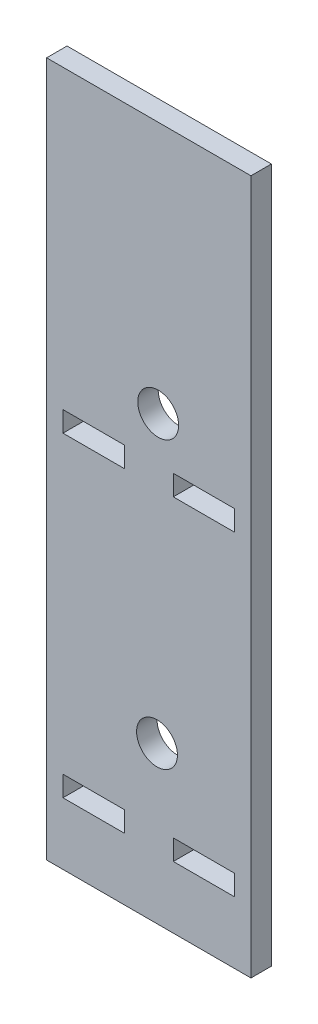
ISO-10303-21;
HEADER;
FILE_DESCRIPTION(('STEP AP214'),'2;1');
FILE_NAME('part.step','',(''),(''),'','','');
FILE_SCHEMA(('AUTOMOTIVE_DESIGN { 1 0 10303 214 1 1 1 1 }'));
ENDSEC;
DATA;
#1=APPLICATION_CONTEXT('core data for automotive mechanical design processes');
#2=APPLICATION_PROTOCOL_DEFINITION('international standard','automotive_design',2000,#1);
#3=PRODUCT_CONTEXT('',#1,'mechanical');
#4=PRODUCT('Part','Part','',(#3));
#5=PRODUCT_RELATED_PRODUCT_CATEGORY('part','',(#4));
#6=PRODUCT_DEFINITION_FORMATION('','',#4);
#7=PRODUCT_DEFINITION_CONTEXT('part definition',#1,'design');
#8=PRODUCT_DEFINITION('design','',#6,#7);
#9=PRODUCT_DEFINITION_SHAPE('','',#8);
#10=(LENGTH_UNIT() NAMED_UNIT(*) SI_UNIT(.MILLI.,.METRE.));
#11=(NAMED_UNIT(*) PLANE_ANGLE_UNIT() SI_UNIT($,.RADIAN.));
#12=(NAMED_UNIT(*) SI_UNIT($,.STERADIAN.) SOLID_ANGLE_UNIT());
#13=UNCERTAINTY_MEASURE_WITH_UNIT(LENGTH_MEASURE(1.E-05),#10,'distance_accuracy_value','');
#14=(GEOMETRIC_REPRESENTATION_CONTEXT(3) GLOBAL_UNCERTAINTY_ASSIGNED_CONTEXT((#13)) GLOBAL_UNIT_ASSIGNED_CONTEXT((#10,
#11,#12)) REPRESENTATION_CONTEXT('',''));
#15=CARTESIAN_POINT('',(0.,0.,0.));
#16=DIRECTION('',(0.,0.,1.));
#17=DIRECTION('',(1.,0.,0.));
#18=AXIS2_PLACEMENT_3D('',#15,#16,#17);
#19=CARTESIAN_POINT('',(0.,0.,5.));
#20=DIRECTION('',(0.,0.,1.));
#21=DIRECTION('',(1.,0.,0.));
#22=AXIS2_PLACEMENT_3D('',#19,#20,#21);
#23=PLANE('',#22);
#24=CARTESIAN_POINT('',(-15.705505675789,29.9997392423794,5.));
#25=DIRECTION('',(0.,0.,1.));
#26=DIRECTION('',(1.,0.,0.));
#27=AXIS2_PLACEMENT_3D('',#24,#25,#26);
#28=CIRCLE('',#27,4.99999999999426);
#29=CARTESIAN_POINT('',(-10.7055056757948,29.9997392423794,5.));
#30=VERTEX_POINT('',#29);
#31=EDGE_CURVE('E277',#30,#30,#28,.T.);
#32=ORIENTED_EDGE('',*,*,#31,.F.);
#33=EDGE_LOOP('',(#32));
#34=FACE_BOUND('',#33,.T.);
#35=DIRECTION('',(0.,-1.,0.));
#36=VECTOR('',#35,1.);
#37=CARTESIAN_POINT('',(-42.7193109279734,161.759780871255,5.));
#38=LINE('',#37,#36);
#39=CARTESIAN_POINT('',(-42.7193109279734,161.759780871255,5.));
#40=VERTEX_POINT('',#39);
#41=CARTESIAN_POINT('',(-42.7193109279733,-8.2402191287452,5.));
#42=VERTEX_POINT('',#41);
#43=EDGE_CURVE('E314',#40,#42,#38,.T.);
#44=ORIENTED_EDGE('',*,*,#43,.T.);
#45=DIRECTION('',(1.,0.,0.));
#46=VECTOR('',#45,1.);
#47=CARTESIAN_POINT('',(-42.7193109279733,-8.2402191287452,5.));
#48=LINE('',#47,#46);
#49=CARTESIAN_POINT('',(7.28068907202665,-8.2402191287452,5.));
#50=VERTEX_POINT('',#49);
#51=EDGE_CURVE('E317',#42,#50,#48,.T.);
#52=ORIENTED_EDGE('',*,*,#51,.T.);
#53=DIRECTION('',(0.,1.,0.));
#54=VECTOR('',#53,1.);
#55=CARTESIAN_POINT('',(7.28068907202665,-8.2402191287452,5.));
#56=LINE('',#55,#54);
#57=CARTESIAN_POINT('',(7.28068907202668,161.759780871255,5.));
#58=VERTEX_POINT('',#57);
#59=EDGE_CURVE('E320',#50,#58,#56,.T.);
#60=ORIENTED_EDGE('',*,*,#59,.T.);
#61=DIRECTION('',(-1.,0.,0.));
#62=VECTOR('',#61,1.);
#63=CARTESIAN_POINT('',(7.28068907202668,161.759780871255,5.));
#64=LINE('',#63,#62);
#65=EDGE_CURVE('E322',#58,#40,#64,.T.);
#66=ORIENTED_EDGE('',*,*,#65,.T.);
#67=EDGE_LOOP('',(#44,#52,#60,#66));
#68=FACE_BOUND('',#67,.T.);
#69=DIRECTION('',(0.,1.,0.));
#70=VECTOR('',#69,1.);
#71=CARTESIAN_POINT('',(-23.7193109279733,11.9498357263154,5.));
#72=LINE('',#71,#70);
#73=CARTESIAN_POINT('',(-23.7193109279733,6.94983572631544,5.));
#74=VERTEX_POINT('',#73);
#75=CARTESIAN_POINT('',(-23.7193109279733,11.9498357263154,5.));
#76=VERTEX_POINT('',#75);
#77=EDGE_CURVE('E285',#74,#76,#72,.T.);
#78=ORIENTED_EDGE('',*,*,#77,.F.);
#79=DIRECTION('',(1.,0.,0.));
#80=VECTOR('',#79,1.);
#81=CARTESIAN_POINT('',(-23.7193109279733,6.94983572631544,5.));
#82=LINE('',#81,#80);
#83=CARTESIAN_POINT('',(-38.7193109279734,6.94983572631544,5.));
#84=VERTEX_POINT('',#83);
#85=EDGE_CURVE('E283',#84,#74,#82,.T.);
#86=ORIENTED_EDGE('',*,*,#85,.F.);
#87=DIRECTION('',(0.,-1.,0.));
#88=VECTOR('',#87,1.);
#89=CARTESIAN_POINT('',(-38.7193109279734,6.94983572631544,5.));
#90=LINE('',#89,#88);
#91=CARTESIAN_POINT('',(-38.7193109279734,11.9498357263154,5.));
#92=VERTEX_POINT('',#91);
#93=EDGE_CURVE('E291',#92,#84,#90,.T.);
#94=ORIENTED_EDGE('',*,*,#93,.F.);
#95=DIRECTION('',(-1.,0.,0.));
#96=VECTOR('',#95,1.);
#97=CARTESIAN_POINT('',(-38.7193109279734,11.9498357263154,5.));
#98=LINE('',#97,#96);
#99=EDGE_CURVE('E288',#76,#92,#98,.T.);
#100=ORIENTED_EDGE('',*,*,#99,.F.);
#101=EDGE_LOOP('',(#78,#86,#94,#100));
#102=FACE_BOUND('',#101,.T.);
#103=CARTESIAN_POINT('',(-15.4136462347418,99.9997392423794,5.));
#104=DIRECTION('',(0.,0.,1.));
#105=DIRECTION('',(1.,0.,0.));
#106=AXIS2_PLACEMENT_3D('',#103,#104,#105);
#107=CIRCLE('',#106,4.99999999998085);
#108=CARTESIAN_POINT('',(-10.4136462347609,99.9997392423794,5.));
#109=VERTEX_POINT('',#108);
#110=EDGE_CURVE('E271',#109,#109,#107,.T.);
#111=ORIENTED_EDGE('',*,*,#110,.F.);
#112=EDGE_LOOP('',(#111));
#113=FACE_BOUND('',#112,.T.);
#114=DIRECTION('',(1.,0.,0.));
#115=VECTOR('',#114,1.);
#116=CARTESIAN_POINT('',(-38.7193109279734,84.2165810531214,5.));
#117=LINE('',#116,#115);
#118=CARTESIAN_POINT('',(-38.7193109279734,84.2165810531214,5.));
#119=VERTEX_POINT('',#118);
#120=CARTESIAN_POINT('',(-23.7193109279733,84.2165810531214,5.));
#121=VERTEX_POINT('',#120);
#122=EDGE_CURVE('E242',#119,#121,#117,.T.);
#123=ORIENTED_EDGE('',*,*,#122,.F.);
#124=DIRECTION('',(0.,-1.,0.));
#125=VECTOR('',#124,1.);
#126=CARTESIAN_POINT('',(-38.7193109279734,89.2165810531214,5.));
#127=LINE('',#126,#125);
#128=CARTESIAN_POINT('',(-38.7193109279734,89.2165810531214,5.));
#129=VERTEX_POINT('',#128);
#130=EDGE_CURVE('E240',#129,#119,#127,.T.);
#131=ORIENTED_EDGE('',*,*,#130,.F.);
#132=DIRECTION('',(-1.,0.,0.));
#133=VECTOR('',#132,1.);
#134=CARTESIAN_POINT('',(-23.7193109279733,89.2165810531214,5.));
#135=LINE('',#134,#133);
#136=CARTESIAN_POINT('',(-23.7193109279733,89.2165810531214,5.));
#137=VERTEX_POINT('',#136);
#138=EDGE_CURVE('E248',#137,#129,#135,.T.);
#139=ORIENTED_EDGE('',*,*,#138,.F.);
#140=DIRECTION('',(0.,1.,0.));
#141=VECTOR('',#140,1.);
#142=CARTESIAN_POINT('',(-23.7193109279733,84.2165810531214,5.));
#143=LINE('',#142,#141);
#144=EDGE_CURVE('E245',#121,#137,#143,.T.);
#145=ORIENTED_EDGE('',*,*,#144,.F.);
#146=EDGE_LOOP('',(#123,#131,#139,#145));
#147=FACE_BOUND('',#146,.T.);
#148=DIRECTION('',(-1.,0.,0.));
#149=VECTOR('',#148,1.);
#150=CARTESIAN_POINT('',(-11.7193109279733,89.2165810531214,5.));
#151=LINE('',#150,#149);
#152=CARTESIAN_POINT('',(3.28068907202665,89.2165810531214,5.));
#153=VERTEX_POINT('',#152);
#154=CARTESIAN_POINT('',(-11.7193109279733,89.2165810531214,5.));
#155=VERTEX_POINT('',#154);
#156=EDGE_CURVE('E211',#153,#155,#151,.T.);
#157=ORIENTED_EDGE('',*,*,#156,.F.);
#158=DIRECTION('',(0.,1.,0.));
#159=VECTOR('',#158,1.);
#160=CARTESIAN_POINT('',(3.28068907202665,89.2165810531214,5.));
#161=LINE('',#160,#159);
#162=CARTESIAN_POINT('',(3.28068907202665,84.2165810531214,5.));
#163=VERTEX_POINT('',#162);
#164=EDGE_CURVE('E209',#163,#153,#161,.T.);
#165=ORIENTED_EDGE('',*,*,#164,.F.);
#166=DIRECTION('',(1.,0.,0.));
#167=VECTOR('',#166,1.);
#168=CARTESIAN_POINT('',(3.28068907202665,84.2165810531214,5.));
#169=LINE('',#168,#167);
#170=CARTESIAN_POINT('',(-11.7193109279733,84.2165810531214,5.));
#171=VERTEX_POINT('',#170);
#172=EDGE_CURVE('E217',#171,#163,#169,.T.);
#173=ORIENTED_EDGE('',*,*,#172,.F.);
#174=DIRECTION('',(0.,-1.,0.));
#175=VECTOR('',#174,1.);
#176=CARTESIAN_POINT('',(-11.7193109279733,84.2165810531214,5.));
#177=LINE('',#176,#175);
#178=EDGE_CURVE('E214',#155,#171,#177,.T.);
#179=ORIENTED_EDGE('',*,*,#178,.F.);
#180=EDGE_LOOP('',(#157,#165,#173,#179));
#181=FACE_BOUND('',#180,.T.);
#182=DIRECTION('',(0.,-1.,0.));
#183=VECTOR('',#182,1.);
#184=CARTESIAN_POINT('',(-11.7193109279733,11.9498357263154,5.));
#185=LINE('',#184,#183);
#186=CARTESIAN_POINT('',(-11.7193109279733,11.9498357263154,5.));
#187=VERTEX_POINT('',#186);
#188=CARTESIAN_POINT('',(-11.7193109279733,6.94983572631544,5.));
#189=VERTEX_POINT('',#188);
#190=EDGE_CURVE('E181',#187,#189,#185,.T.);
#191=ORIENTED_EDGE('',*,*,#190,.F.);
#192=DIRECTION('',(-1.,0.,0.));
#193=VECTOR('',#192,1.);
#194=CARTESIAN_POINT('',(3.28068907202665,11.9498357263154,5.));
#195=LINE('',#194,#193);
#196=CARTESIAN_POINT('',(3.28068907202665,11.9498357263154,5.));
#197=VERTEX_POINT('',#196);
#198=EDGE_CURVE('E173',#197,#187,#195,.T.);
#199=ORIENTED_EDGE('',*,*,#198,.F.);
#200=DIRECTION('',(0.,1.,0.));
#201=VECTOR('',#200,1.);
#202=CARTESIAN_POINT('',(3.28068907202665,6.94983572631544,5.));
#203=LINE('',#202,#201);
#204=CARTESIAN_POINT('',(3.28068907202665,6.94983572631544,5.));
#205=VERTEX_POINT('',#204);
#206=EDGE_CURVE('E195',#205,#197,#203,.T.);
#207=ORIENTED_EDGE('',*,*,#206,.F.);
#208=DIRECTION('',(1.,0.,0.));
#209=VECTOR('',#208,1.);
#210=CARTESIAN_POINT('',(-11.7193109279733,6.94983572631544,5.));
#211=LINE('',#210,#209);
#212=EDGE_CURVE('E193',#189,#205,#211,.T.);
#213=ORIENTED_EDGE('',*,*,#212,.F.);
#214=EDGE_LOOP('',(#191,#199,#207,#213));
#215=FACE_BOUND('',#214,.T.);
#216=ADVANCED_FACE('F36',(#34,#68,#102,#113,#147,#181,#215),#23,.T.);
#217=CARTESIAN_POINT('',(0.,0.,0.));
#218=DIRECTION('',(0.,0.,1.));
#219=DIRECTION('',(1.,0.,0.));
#220=AXIS2_PLACEMENT_3D('',#217,#218,#219);
#221=PLANE('',#220);
#222=DIRECTION('',(0.,1.,0.));
#223=VECTOR('',#222,1.);
#224=CARTESIAN_POINT('',(3.28068907202665,89.2165810531214,0.));
#225=LINE('',#224,#223);
#226=CARTESIAN_POINT('',(3.28068907202665,84.2165810531214,0.));
#227=VERTEX_POINT('',#226);
#228=CARTESIAN_POINT('',(3.28068907202665,89.2165810531214,0.));
#229=VERTEX_POINT('',#228);
#230=EDGE_CURVE('E189',#227,#229,#225,.T.);
#231=ORIENTED_EDGE('',*,*,#230,.T.);
#232=DIRECTION('',(-1.,0.,0.));
#233=VECTOR('',#232,1.);
#234=CARTESIAN_POINT('',(-11.7193109279733,89.2165810531214,0.));
#235=LINE('',#234,#233);
#236=CARTESIAN_POINT('',(-11.7193109279733,89.2165810531214,0.));
#237=VERTEX_POINT('',#236);
#238=EDGE_CURVE('E222',#229,#237,#235,.T.);
#239=ORIENTED_EDGE('',*,*,#238,.T.);
#240=DIRECTION('',(0.,-1.,0.));
#241=VECTOR('',#240,1.);
#242=CARTESIAN_POINT('',(-11.7193109279733,84.2165810531214,0.));
#243=LINE('',#242,#241);
#244=CARTESIAN_POINT('',(-11.7193109279733,84.2165810531214,0.));
#245=VERTEX_POINT('',#244);
#246=EDGE_CURVE('E225',#237,#245,#243,.T.);
#247=ORIENTED_EDGE('',*,*,#246,.T.);
#248=DIRECTION('',(1.,0.,0.));
#249=VECTOR('',#248,1.);
#250=CARTESIAN_POINT('',(3.28068907202665,84.2165810531214,0.));
#251=LINE('',#250,#249);
#252=EDGE_CURVE('E212',#245,#227,#251,.T.);
#253=ORIENTED_EDGE('',*,*,#252,.T.);
#254=EDGE_LOOP('',(#231,#239,#247,#253));
#255=FACE_BOUND('',#254,.T.);
#256=CARTESIAN_POINT('',(-15.4136462347418,99.9997392423794,0.));
#257=DIRECTION('',(0.,0.,1.));
#258=DIRECTION('',(1.,0.,0.));
#259=AXIS2_PLACEMENT_3D('',#256,#257,#258);
#260=CIRCLE('',#259,4.99999999998085);
#261=CARTESIAN_POINT('',(-10.4136462347609,99.9997392423794,0.));
#262=VERTEX_POINT('',#261);
#263=EDGE_CURVE('E270',#262,#262,#260,.T.);
#264=ORIENTED_EDGE('',*,*,#263,.T.);
#265=EDGE_LOOP('',(#264));
#266=FACE_BOUND('',#265,.T.);
#267=CARTESIAN_POINT('',(-15.705505675789,29.9997392423794,0.));
#268=DIRECTION('',(0.,0.,1.));
#269=DIRECTION('',(1.,0.,0.));
#270=AXIS2_PLACEMENT_3D('',#267,#268,#269);
#271=CIRCLE('',#270,4.99999999999426);
#272=CARTESIAN_POINT('',(-10.7055056757948,29.9997392423794,0.));
#273=VERTEX_POINT('',#272);
#274=EDGE_CURVE('E274',#273,#273,#271,.T.);
#275=ORIENTED_EDGE('',*,*,#274,.T.);
#276=EDGE_LOOP('',(#275));
#277=FACE_BOUND('',#276,.T.);
#278=DIRECTION('',(1.,0.,0.));
#279=VECTOR('',#278,1.);
#280=CARTESIAN_POINT('',(-23.7193109279733,6.94983572631544,0.));
#281=LINE('',#280,#279);
#282=CARTESIAN_POINT('',(-38.7193109279734,6.94983572631544,0.));
#283=VERTEX_POINT('',#282);
#284=CARTESIAN_POINT('',(-23.7193109279733,6.94983572631544,0.));
#285=VERTEX_POINT('',#284);
#286=EDGE_CURVE('E280',#283,#285,#281,.T.);
#287=ORIENTED_EDGE('',*,*,#286,.T.);
#288=DIRECTION('',(0.,1.,0.));
#289=VECTOR('',#288,1.);
#290=CARTESIAN_POINT('',(-23.7193109279733,11.9498357263154,0.));
#291=LINE('',#290,#289);
#292=CARTESIAN_POINT('',(-23.7193109279733,11.9498357263154,0.));
#293=VERTEX_POINT('',#292);
#294=EDGE_CURVE('E296',#285,#293,#291,.T.);
#295=ORIENTED_EDGE('',*,*,#294,.T.);
#296=DIRECTION('',(-1.,0.,0.));
#297=VECTOR('',#296,1.);
#298=CARTESIAN_POINT('',(-38.7193109279734,11.9498357263154,0.));
#299=LINE('',#298,#297);
#300=CARTESIAN_POINT('',(-38.7193109279734,11.9498357263154,0.));
#301=VERTEX_POINT('',#300);
#302=EDGE_CURVE('E299',#293,#301,#299,.T.);
#303=ORIENTED_EDGE('',*,*,#302,.T.);
#304=DIRECTION('',(0.,-1.,0.));
#305=VECTOR('',#304,1.);
#306=CARTESIAN_POINT('',(-38.7193109279734,6.94983572631544,0.));
#307=LINE('',#306,#305);
#308=EDGE_CURVE('E286',#301,#283,#307,.T.);
#309=ORIENTED_EDGE('',*,*,#308,.T.);
#310=EDGE_LOOP('',(#287,#295,#303,#309));
#311=FACE_BOUND('',#310,.T.);
#312=DIRECTION('',(0.,-1.,0.));
#313=VECTOR('',#312,1.);
#314=CARTESIAN_POINT('',(-42.7193109279734,161.759780871255,0.));
#315=LINE('',#314,#313);
#316=CARTESIAN_POINT('',(-42.7193109279734,161.759780871255,0.));
#317=VERTEX_POINT('',#316);
#318=CARTESIAN_POINT('',(-42.7193109279733,-8.2402191287452,0.));
#319=VERTEX_POINT('',#318);
#320=EDGE_CURVE('E313',#317,#319,#315,.T.);
#321=ORIENTED_EDGE('',*,*,#320,.F.);
#322=DIRECTION('',(-1.,0.,0.));
#323=VECTOR('',#322,1.);
#324=CARTESIAN_POINT('',(7.28068907202668,161.759780871255,0.));
#325=LINE('',#324,#323);
#326=CARTESIAN_POINT('',(7.28068907202668,161.759780871255,0.));
#327=VERTEX_POINT('',#326);
#328=EDGE_CURVE('E318',#327,#317,#325,.T.);
#329=ORIENTED_EDGE('',*,*,#328,.F.);
#330=DIRECTION('',(0.,1.,0.));
#331=VECTOR('',#330,1.);
#332=CARTESIAN_POINT('',(7.28068907202665,-8.2402191287452,0.));
#333=LINE('',#332,#331);
#334=CARTESIAN_POINT('',(7.28068907202665,-8.2402191287452,0.));
#335=VERTEX_POINT('',#334);
#336=EDGE_CURVE('E329',#335,#327,#333,.T.);
#337=ORIENTED_EDGE('',*,*,#336,.F.);
#338=DIRECTION('',(1.,0.,0.));
#339=VECTOR('',#338,1.);
#340=CARTESIAN_POINT('',(-42.7193109279733,-8.2402191287452,0.));
#341=LINE('',#340,#339);
#342=EDGE_CURVE('E327',#319,#335,#341,.T.);
#343=ORIENTED_EDGE('',*,*,#342,.F.);
#344=EDGE_LOOP('',(#321,#329,#337,#343));
#345=FACE_BOUND('',#344,.T.);
#346=DIRECTION('',(0.,-1.,0.));
#347=VECTOR('',#346,1.);
#348=CARTESIAN_POINT('',(-38.7193109279734,89.2165810531214,0.));
#349=LINE('',#348,#347);
#350=CARTESIAN_POINT('',(-38.7193109279734,89.2165810531214,0.));
#351=VERTEX_POINT('',#350);
#352=CARTESIAN_POINT('',(-38.7193109279734,84.2165810531214,0.));
#353=VERTEX_POINT('',#352);
#354=EDGE_CURVE('E239',#351,#353,#349,.T.);
#355=ORIENTED_EDGE('',*,*,#354,.T.);
#356=DIRECTION('',(1.,0.,0.));
#357=VECTOR('',#356,1.);
#358=CARTESIAN_POINT('',(-38.7193109279734,84.2165810531214,0.));
#359=LINE('',#358,#357);
#360=CARTESIAN_POINT('',(-23.7193109279733,84.2165810531214,0.));
#361=VERTEX_POINT('',#360);
#362=EDGE_CURVE('E253',#353,#361,#359,.T.);
#363=ORIENTED_EDGE('',*,*,#362,.T.);
#364=DIRECTION('',(0.,1.,0.));
#365=VECTOR('',#364,1.);
#366=CARTESIAN_POINT('',(-23.7193109279733,84.2165810531214,0.));
#367=LINE('',#366,#365);
#368=CARTESIAN_POINT('',(-23.7193109279733,89.2165810531214,0.));
#369=VERTEX_POINT('',#368);
#370=EDGE_CURVE('E256',#361,#369,#367,.T.);
#371=ORIENTED_EDGE('',*,*,#370,.T.);
#372=DIRECTION('',(-1.,0.,0.));
#373=VECTOR('',#372,1.);
#374=CARTESIAN_POINT('',(-23.7193109279733,89.2165810531214,0.));
#375=LINE('',#374,#373);
#376=EDGE_CURVE('E243',#369,#351,#375,.T.);
#377=ORIENTED_EDGE('',*,*,#376,.T.);
#378=EDGE_LOOP('',(#355,#363,#371,#377));
#379=FACE_BOUND('',#378,.T.);
#380=DIRECTION('',(-1.,0.,0.));
#381=VECTOR('',#380,1.);
#382=CARTESIAN_POINT('',(3.28068907202665,11.9498357263154,0.));
#383=LINE('',#382,#381);
#384=CARTESIAN_POINT('',(3.28068907202665,11.9498357263154,0.));
#385=VERTEX_POINT('',#384);
#386=CARTESIAN_POINT('',(-11.7193109279733,11.9498357263154,0.));
#387=VERTEX_POINT('',#386);
#388=EDGE_CURVE('E59',#385,#387,#383,.T.);
#389=ORIENTED_EDGE('',*,*,#388,.T.);
#390=DIRECTION('',(0.,-1.,0.));
#391=VECTOR('',#390,1.);
#392=CARTESIAN_POINT('',(-11.7193109279733,11.9498357263154,0.));
#393=LINE('',#392,#391);
#394=CARTESIAN_POINT('',(-11.7193109279733,6.94983572631544,0.));
#395=VERTEX_POINT('',#394);
#396=EDGE_CURVE('E188',#387,#395,#393,.T.);
#397=ORIENTED_EDGE('',*,*,#396,.T.);
#398=DIRECTION('',(1.,0.,0.));
#399=VECTOR('',#398,1.);
#400=CARTESIAN_POINT('',(-11.7193109279733,6.94983572631544,0.));
#401=LINE('',#400,#399);
#402=CARTESIAN_POINT('',(3.28068907202665,6.94983572631544,0.));
#403=VERTEX_POINT('',#402);
#404=EDGE_CURVE('E201',#395,#403,#401,.T.);
#405=ORIENTED_EDGE('',*,*,#404,.T.);
#406=DIRECTION('',(0.,1.,0.));
#407=VECTOR('',#406,1.);
#408=CARTESIAN_POINT('',(3.28068907202665,6.94983572631544,0.));
#409=LINE('',#408,#407);
#410=EDGE_CURVE('E182',#403,#385,#409,.T.);
#411=ORIENTED_EDGE('',*,*,#410,.T.);
#412=EDGE_LOOP('',(#389,#397,#405,#411));
#413=FACE_BOUND('',#412,.T.);
#414=ADVANCED_FACE('F347',(#255,#266,#277,#311,#345,#379,#413),#221,.F.);
#415=CARTESIAN_POINT('',(-42.7193109279734,161.759780871255,5.));
#416=DIRECTION('',(1.,0.,0.));
#417=DIRECTION('',(0.,1.,0.));
#418=AXIS2_PLACEMENT_3D('',#415,#416,#417);
#419=PLANE('',#418);
#420=ORIENTED_EDGE('',*,*,#320,.T.);
#421=DIRECTION('',(0.,0.,-1.));
#422=VECTOR('',#421,1.);
#423=CARTESIAN_POINT('',(-42.7193109279733,-8.2402191287452,5.));
#424=LINE('',#423,#422);
#425=EDGE_CURVE('E11',#42,#319,#424,.T.);
#426=ORIENTED_EDGE('',*,*,#425,.F.);
#427=ORIENTED_EDGE('',*,*,#43,.F.);
#428=DIRECTION('',(0.,0.,-1.));
#429=VECTOR('',#428,1.);
#430=CARTESIAN_POINT('',(-42.7193109279734,161.759780871255,5.));
#431=LINE('',#430,#429);
#432=EDGE_CURVE('E324',#40,#317,#431,.T.);
#433=ORIENTED_EDGE('',*,*,#432,.T.);
#434=EDGE_LOOP('',(#420,#426,#427,#433));
#435=FACE_BOUND('',#434,.T.);
#436=ADVANCED_FACE('F38',(#435),#419,.F.);
#437=CARTESIAN_POINT('',(-42.7193109279733,-8.2402191287452,5.));
#438=DIRECTION('',(0.,1.,0.));
#439=DIRECTION('',(0.,0.,1.));
#440=AXIS2_PLACEMENT_3D('',#437,#438,#439);
#441=PLANE('',#440);
#442=ORIENTED_EDGE('',*,*,#342,.T.);
#443=DIRECTION('',(0.,0.,-1.));
#444=VECTOR('',#443,1.);
#445=CARTESIAN_POINT('',(7.28068907202665,-8.2402191287452,5.));
#446=LINE('',#445,#444);
#447=EDGE_CURVE('E44',#50,#335,#446,.T.);
#448=ORIENTED_EDGE('',*,*,#447,.F.);
#449=ORIENTED_EDGE('',*,*,#51,.F.);
#450=ORIENTED_EDGE('',*,*,#425,.T.);
#451=EDGE_LOOP('',(#442,#448,#449,#450));
#452=FACE_BOUND('',#451,.T.);
#453=ADVANCED_FACE('F358',(#452),#441,.F.);
#454=CARTESIAN_POINT('',(7.28068907202665,-8.2402191287452,5.));
#455=DIRECTION('',(-1.,0.,0.));
#456=DIRECTION('',(0.,-1.,0.));
#457=AXIS2_PLACEMENT_3D('',#454,#455,#456);
#458=PLANE('',#457);
#459=ORIENTED_EDGE('',*,*,#336,.T.);
#460=DIRECTION('',(0.,0.,-1.));
#461=VECTOR('',#460,1.);
#462=CARTESIAN_POINT('',(7.28068907202668,161.759780871255,5.));
#463=LINE('',#462,#461);
#464=EDGE_CURVE('E334',#58,#327,#463,.T.);
#465=ORIENTED_EDGE('',*,*,#464,.F.);
#466=ORIENTED_EDGE('',*,*,#59,.F.);
#467=ORIENTED_EDGE('',*,*,#447,.T.);
#468=EDGE_LOOP('',(#459,#465,#466,#467));
#469=FACE_BOUND('',#468,.T.);
#470=ADVANCED_FACE('F341',(#469),#458,.F.);
#471=CARTESIAN_POINT('',(7.28068907202668,161.759780871255,5.));
#472=DIRECTION('',(0.,-1.,0.));
#473=DIRECTION('',(0.,0.,-1.));
#474=AXIS2_PLACEMENT_3D('',#471,#472,#473);
#475=PLANE('',#474);
#476=ORIENTED_EDGE('',*,*,#328,.T.);
#477=ORIENTED_EDGE('',*,*,#432,.F.);
#478=ORIENTED_EDGE('',*,*,#65,.F.);
#479=ORIENTED_EDGE('',*,*,#464,.T.);
#480=EDGE_LOOP('',(#476,#477,#478,#479));
#481=FACE_BOUND('',#480,.T.);
#482=ADVANCED_FACE('F351',(#481),#475,.F.);
#483=CARTESIAN_POINT('',(-23.7193109279733,6.94983572631544,5.));
#484=DIRECTION('',(0.,1.,0.));
#485=DIRECTION('',(0.,0.,1.));
#486=AXIS2_PLACEMENT_3D('',#483,#484,#485);
#487=PLANE('',#486);
#488=ORIENTED_EDGE('',*,*,#286,.F.);
#489=DIRECTION('',(0.,0.,-1.));
#490=VECTOR('',#489,1.);
#491=CARTESIAN_POINT('',(-38.7193109279734,6.94983572631544,5.));
#492=LINE('',#491,#490);
#493=EDGE_CURVE('E293',#84,#283,#492,.T.);
#494=ORIENTED_EDGE('',*,*,#493,.F.);
#495=ORIENTED_EDGE('',*,*,#85,.T.);
#496=DIRECTION('',(0.,0.,-1.));
#497=VECTOR('',#496,1.);
#498=CARTESIAN_POINT('',(-23.7193109279733,6.94983572631544,5.));
#499=LINE('',#498,#497);
#500=EDGE_CURVE('E310',#74,#285,#499,.T.);
#501=ORIENTED_EDGE('',*,*,#500,.T.);
#502=EDGE_LOOP('',(#488,#494,#495,#501));
#503=FACE_BOUND('',#502,.T.);
#504=ADVANCED_FACE('F375',(#503),#487,.T.);
#505=CARTESIAN_POINT('',(-23.7193109279733,11.9498357263154,5.));
#506=DIRECTION('',(-1.,0.,0.));
#507=DIRECTION('',(0.,0.,1.));
#508=AXIS2_PLACEMENT_3D('',#505,#506,#507);
#509=PLANE('',#508);
#510=ORIENTED_EDGE('',*,*,#294,.F.);
#511=ORIENTED_EDGE('',*,*,#500,.F.);
#512=ORIENTED_EDGE('',*,*,#77,.T.);
#513=DIRECTION('',(0.,0.,-1.));
#514=VECTOR('',#513,1.);
#515=CARTESIAN_POINT('',(-23.7193109279733,11.9498357263154,5.));
#516=LINE('',#515,#514);
#517=EDGE_CURVE('E308',#76,#293,#516,.T.);
#518=ORIENTED_EDGE('',*,*,#517,.T.);
#519=EDGE_LOOP('',(#510,#511,#512,#518));
#520=FACE_BOUND('',#519,.T.);
#521=ADVANCED_FACE('F382',(#520),#509,.T.);
#522=CARTESIAN_POINT('',(-38.7193109279734,11.9498357263154,5.));
#523=DIRECTION('',(0.,-1.,0.));
#524=DIRECTION('',(1.,0.,0.));
#525=AXIS2_PLACEMENT_3D('',#522,#523,#524);
#526=PLANE('',#525);
#527=ORIENTED_EDGE('',*,*,#302,.F.);
#528=ORIENTED_EDGE('',*,*,#517,.F.);
#529=ORIENTED_EDGE('',*,*,#99,.T.);
#530=DIRECTION('',(0.,0.,-1.));
#531=VECTOR('',#530,1.);
#532=CARTESIAN_POINT('',(-38.7193109279734,11.9498357263154,5.));
#533=LINE('',#532,#531);
#534=EDGE_CURVE('E306',#92,#301,#533,.T.);
#535=ORIENTED_EDGE('',*,*,#534,.T.);
#536=EDGE_LOOP('',(#527,#528,#529,#535));
#537=FACE_BOUND('',#536,.T.);
#538=ADVANCED_FACE('F387',(#537),#526,.T.);
#539=CARTESIAN_POINT('',(-38.7193109279734,6.94983572631544,5.));
#540=DIRECTION('',(1.,0.,0.));
#541=DIRECTION('',(0.,0.,-1.));
#542=AXIS2_PLACEMENT_3D('',#539,#540,#541);
#543=PLANE('',#542);
#544=ORIENTED_EDGE('',*,*,#308,.F.);
#545=ORIENTED_EDGE('',*,*,#534,.F.);
#546=ORIENTED_EDGE('',*,*,#93,.T.);
#547=ORIENTED_EDGE('',*,*,#493,.T.);
#548=EDGE_LOOP('',(#544,#545,#546,#547));
#549=FACE_BOUND('',#548,.T.);
#550=ADVANCED_FACE('F395',(#549),#543,.T.);
#551=CARTESIAN_POINT('',(-15.705505675789,29.9997392423794,5.));
#552=DIRECTION('',(0.,0.,-1.));
#553=DIRECTION('',(-1.,0.,0.));
#554=AXIS2_PLACEMENT_3D('',#551,#552,#553);
#555=CYLINDRICAL_SURFACE('',#554,4.99999999999426);
#556=ORIENTED_EDGE('',*,*,#31,.T.);
#557=EDGE_LOOP('',(#556));
#558=FACE_BOUND('',#557,.T.);
#559=ORIENTED_EDGE('',*,*,#274,.F.);
#560=EDGE_LOOP('',(#559));
#561=FACE_BOUND('',#560,.T.);
#562=ADVANCED_FACE('F460',(#558,#561),#555,.F.);
#563=CARTESIAN_POINT('',(-15.4136462347418,99.9997392423794,5.));
#564=DIRECTION('',(0.,0.,-1.));
#565=DIRECTION('',(-1.,0.,0.));
#566=AXIS2_PLACEMENT_3D('',#563,#564,#565);
#567=CYLINDRICAL_SURFACE('',#566,4.99999999998085);
#568=ORIENTED_EDGE('',*,*,#110,.T.);
#569=EDGE_LOOP('',(#568));
#570=FACE_BOUND('',#569,.T.);
#571=ORIENTED_EDGE('',*,*,#263,.F.);
#572=EDGE_LOOP('',(#571));
#573=FACE_BOUND('',#572,.T.);
#574=ADVANCED_FACE('F456',(#570,#573),#567,.F.);
#575=CARTESIAN_POINT('',(-38.7193109279734,89.2165810531214,5.));
#576=DIRECTION('',(1.,0.,0.));
#577=DIRECTION('',(0.,0.,-1.));
#578=AXIS2_PLACEMENT_3D('',#575,#576,#577);
#579=PLANE('',#578);
#580=ORIENTED_EDGE('',*,*,#354,.F.);
#581=DIRECTION('',(0.,0.,-1.));
#582=VECTOR('',#581,1.);
#583=CARTESIAN_POINT('',(-38.7193109279734,89.2165810531214,5.));
#584=LINE('',#583,#582);
#585=EDGE_CURVE('E250',#129,#351,#584,.T.);
#586=ORIENTED_EDGE('',*,*,#585,.F.);
#587=ORIENTED_EDGE('',*,*,#130,.T.);
#588=DIRECTION('',(0.,0.,-1.));
#589=VECTOR('',#588,1.);
#590=CARTESIAN_POINT('',(-38.7193109279734,84.2165810531214,5.));
#591=LINE('',#590,#589);
#592=EDGE_CURVE('E267',#119,#353,#591,.T.);
#593=ORIENTED_EDGE('',*,*,#592,.T.);
#594=EDGE_LOOP('',(#580,#586,#587,#593));
#595=FACE_BOUND('',#594,.T.);
#596=ADVANCED_FACE('F452',(#595),#579,.T.);
#597=CARTESIAN_POINT('',(-38.7193109279734,84.2165810531214,5.));
#598=DIRECTION('',(0.,1.,0.));
#599=DIRECTION('',(0.,0.,1.));
#600=AXIS2_PLACEMENT_3D('',#597,#598,#599);
#601=PLANE('',#600);
#602=ORIENTED_EDGE('',*,*,#362,.F.);
#603=ORIENTED_EDGE('',*,*,#592,.F.);
#604=ORIENTED_EDGE('',*,*,#122,.T.);
#605=DIRECTION('',(0.,0.,-1.));
#606=VECTOR('',#605,1.);
#607=CARTESIAN_POINT('',(-23.7193109279733,84.2165810531214,5.));
#608=LINE('',#607,#606);
#609=EDGE_CURVE('E265',#121,#361,#608,.T.);
#610=ORIENTED_EDGE('',*,*,#609,.T.);
#611=EDGE_LOOP('',(#602,#603,#604,#610));
#612=FACE_BOUND('',#611,.T.);
#613=ADVANCED_FACE('F448',(#612),#601,.T.);
#614=CARTESIAN_POINT('',(-23.7193109279733,84.2165810531214,5.));
#615=DIRECTION('',(-1.,0.,0.));
#616=DIRECTION('',(0.,0.,1.));
#617=AXIS2_PLACEMENT_3D('',#614,#615,#616);
#618=PLANE('',#617);
#619=ORIENTED_EDGE('',*,*,#370,.F.);
#620=ORIENTED_EDGE('',*,*,#609,.F.);
#621=ORIENTED_EDGE('',*,*,#144,.T.);
#622=DIRECTION('',(0.,0.,-1.));
#623=VECTOR('',#622,1.);
#624=CARTESIAN_POINT('',(-23.7193109279733,89.2165810531214,5.));
#625=LINE('',#624,#623);
#626=EDGE_CURVE('E263',#137,#369,#625,.T.);
#627=ORIENTED_EDGE('',*,*,#626,.T.);
#628=EDGE_LOOP('',(#619,#620,#621,#627));
#629=FACE_BOUND('',#628,.T.);
#630=ADVANCED_FACE('F444',(#629),#618,.T.);
#631=CARTESIAN_POINT('',(-23.7193109279733,89.2165810531214,5.));
#632=DIRECTION('',(0.,-1.,0.));
#633=DIRECTION('',(0.,0.,-1.));
#634=AXIS2_PLACEMENT_3D('',#631,#632,#633);
#635=PLANE('',#634);
#636=ORIENTED_EDGE('',*,*,#376,.F.);
#637=ORIENTED_EDGE('',*,*,#626,.F.);
#638=ORIENTED_EDGE('',*,*,#138,.T.);
#639=ORIENTED_EDGE('',*,*,#585,.T.);
#640=EDGE_LOOP('',(#636,#637,#638,#639));
#641=FACE_BOUND('',#640,.T.);
#642=ADVANCED_FACE('F441',(#641),#635,.T.);
#643=CARTESIAN_POINT('',(3.28068907202665,89.2165810531214,5.));
#644=DIRECTION('',(-1.,0.,0.));
#645=DIRECTION('',(0.,0.,1.));
#646=AXIS2_PLACEMENT_3D('',#643,#644,#645);
#647=PLANE('',#646);
#648=ORIENTED_EDGE('',*,*,#230,.F.);
#649=DIRECTION('',(0.,0.,-1.));
#650=VECTOR('',#649,1.);
#651=CARTESIAN_POINT('',(3.28068907202665,84.2165810531214,5.));
#652=LINE('',#651,#650);
#653=EDGE_CURVE('E219',#163,#227,#652,.T.);
#654=ORIENTED_EDGE('',*,*,#653,.F.);
#655=ORIENTED_EDGE('',*,*,#164,.T.);
#656=DIRECTION('',(0.,0.,-1.));
#657=VECTOR('',#656,1.);
#658=CARTESIAN_POINT('',(3.28068907202665,89.2165810531214,5.));
#659=LINE('',#658,#657);
#660=EDGE_CURVE('E236',#153,#229,#659,.T.);
#661=ORIENTED_EDGE('',*,*,#660,.T.);
#662=EDGE_LOOP('',(#648,#654,#655,#661));
#663=FACE_BOUND('',#662,.T.);
#664=ADVANCED_FACE('F423',(#663),#647,.T.);
#665=CARTESIAN_POINT('',(-11.7193109279733,89.2165810531214,5.));
#666=DIRECTION('',(0.,-1.,0.));
#667=DIRECTION('',(0.,0.,-1.));
#668=AXIS2_PLACEMENT_3D('',#665,#666,#667);
#669=PLANE('',#668);
#670=ORIENTED_EDGE('',*,*,#238,.F.);
#671=ORIENTED_EDGE('',*,*,#660,.F.);
#672=ORIENTED_EDGE('',*,*,#156,.T.);
#673=DIRECTION('',(0.,0.,-1.));
#674=VECTOR('',#673,1.);
#675=CARTESIAN_POINT('',(-11.7193109279733,89.2165810531214,5.));
#676=LINE('',#675,#674);
#677=EDGE_CURVE('E234',#155,#237,#676,.T.);
#678=ORIENTED_EDGE('',*,*,#677,.T.);
#679=EDGE_LOOP('',(#670,#671,#672,#678));
#680=FACE_BOUND('',#679,.T.);
#681=ADVANCED_FACE('F416',(#680),#669,.T.);
#682=CARTESIAN_POINT('',(-11.7193109279733,84.2165810531214,5.));
#683=DIRECTION('',(1.,0.,0.));
#684=DIRECTION('',(0.,0.,-1.));
#685=AXIS2_PLACEMENT_3D('',#682,#683,#684);
#686=PLANE('',#685);
#687=ORIENTED_EDGE('',*,*,#246,.F.);
#688=ORIENTED_EDGE('',*,*,#677,.F.);
#689=ORIENTED_EDGE('',*,*,#178,.T.);
#690=DIRECTION('',(0.,0.,-1.));
#691=VECTOR('',#690,1.);
#692=CARTESIAN_POINT('',(-11.7193109279733,84.2165810531214,5.));
#693=LINE('',#692,#691);
#694=EDGE_CURVE('E232',#171,#245,#693,.T.);
#695=ORIENTED_EDGE('',*,*,#694,.T.);
#696=EDGE_LOOP('',(#687,#688,#689,#695));
#697=FACE_BOUND('',#696,.T.);
#698=ADVANCED_FACE('F419',(#697),#686,.T.);
#699=CARTESIAN_POINT('',(3.28068907202665,84.2165810531214,5.));
#700=DIRECTION('',(0.,1.,0.));
#701=DIRECTION('',(0.,0.,1.));
#702=AXIS2_PLACEMENT_3D('',#699,#700,#701);
#703=PLANE('',#702);
#704=ORIENTED_EDGE('',*,*,#252,.F.);
#705=ORIENTED_EDGE('',*,*,#694,.F.);
#706=ORIENTED_EDGE('',*,*,#172,.T.);
#707=ORIENTED_EDGE('',*,*,#653,.T.);
#708=EDGE_LOOP('',(#704,#705,#706,#707));
#709=FACE_BOUND('',#708,.T.);
#710=ADVANCED_FACE('F426',(#709),#703,.T.);
#711=CARTESIAN_POINT('',(3.28068907202665,11.9498357263154,5.));
#712=DIRECTION('',(0.,-1.,0.));
#713=DIRECTION('',(1.,0.,0.));
#714=AXIS2_PLACEMENT_3D('',#711,#712,#713);
#715=PLANE('',#714);
#716=ORIENTED_EDGE('',*,*,#388,.F.);
#717=DIRECTION('',(0.,0.,-1.));
#718=VECTOR('',#717,1.);
#719=CARTESIAN_POINT('',(3.28068907202665,11.9498357263154,5.));
#720=LINE('',#719,#718);
#721=EDGE_CURVE('E177',#197,#385,#720,.T.);
#722=ORIENTED_EDGE('',*,*,#721,.F.);
#723=ORIENTED_EDGE('',*,*,#198,.T.);
#724=DIRECTION('',(0.,0.,-1.));
#725=VECTOR('',#724,1.);
#726=CARTESIAN_POINT('',(-11.7193109279733,11.9498357263154,5.));
#727=LINE('',#726,#725);
#728=EDGE_CURVE('E176',#187,#387,#727,.T.);
#729=ORIENTED_EDGE('',*,*,#728,.T.);
#730=EDGE_LOOP('',(#716,#722,#723,#729));
#731=FACE_BOUND('',#730,.T.);
#732=ADVANCED_FACE('F175',(#731),#715,.T.);
#733=CARTESIAN_POINT('',(-11.7193109279733,11.9498357263154,5.));
#734=DIRECTION('',(1.,0.,0.));
#735=DIRECTION('',(0.,0.,-1.));
#736=AXIS2_PLACEMENT_3D('',#733,#734,#735);
#737=PLANE('',#736);
#738=ORIENTED_EDGE('',*,*,#396,.F.);
#739=ORIENTED_EDGE('',*,*,#728,.F.);
#740=ORIENTED_EDGE('',*,*,#190,.T.);
#741=DIRECTION('',(0.,0.,-1.));
#742=VECTOR('',#741,1.);
#743=CARTESIAN_POINT('',(-11.7193109279733,6.94983572631544,5.));
#744=LINE('',#743,#742);
#745=EDGE_CURVE('E190',#189,#395,#744,.T.);
#746=ORIENTED_EDGE('',*,*,#745,.T.);
#747=EDGE_LOOP('',(#738,#739,#740,#746));
#748=FACE_BOUND('',#747,.T.);
#749=ADVANCED_FACE('F185',(#748),#737,.T.);
#750=CARTESIAN_POINT('',(-11.7193109279733,6.94983572631544,5.));
#751=DIRECTION('',(0.,1.,0.));
#752=DIRECTION('',(0.,0.,1.));
#753=AXIS2_PLACEMENT_3D('',#750,#751,#752);
#754=PLANE('',#753);
#755=ORIENTED_EDGE('',*,*,#404,.F.);
#756=ORIENTED_EDGE('',*,*,#745,.F.);
#757=ORIENTED_EDGE('',*,*,#212,.T.);
#758=DIRECTION('',(0.,0.,-1.));
#759=VECTOR('',#758,1.);
#760=CARTESIAN_POINT('',(3.28068907202665,6.94983572631544,5.));
#761=LINE('',#760,#759);
#762=EDGE_CURVE('E51',#205,#403,#761,.T.);
#763=ORIENTED_EDGE('',*,*,#762,.T.);
#764=EDGE_LOOP('',(#755,#756,#757,#763));
#765=FACE_BOUND('',#764,.T.);
#766=ADVANCED_FACE('F531',(#765),#754,.T.);
#767=CARTESIAN_POINT('',(3.28068907202665,6.94983572631544,5.));
#768=DIRECTION('',(-1.,0.,0.));
#769=DIRECTION('',(0.,0.,1.));
#770=AXIS2_PLACEMENT_3D('',#767,#768,#769);
#771=PLANE('',#770);
#772=ORIENTED_EDGE('',*,*,#410,.F.);
#773=ORIENTED_EDGE('',*,*,#762,.F.);
#774=ORIENTED_EDGE('',*,*,#206,.T.);
#775=ORIENTED_EDGE('',*,*,#721,.T.);
#776=EDGE_LOOP('',(#772,#773,#774,#775));
#777=FACE_BOUND('',#776,.T.);
#778=ADVANCED_FACE('F539',(#777),#771,.T.);
#779=CLOSED_SHELL('',(#216,#414,#436,#453,#470,#482,#504,#521,#538,#550,#562,#574,#596,#613,
#630,#642,#664,#681,#698,#710,#732,#749,#766,#778));
#780=MANIFOLD_SOLID_BREP('B2',#779);
#781=ADVANCED_BREP_SHAPE_REPRESENTATION('',(#18,#780),#14);
#782=SHAPE_DEFINITION_REPRESENTATION(#9,#781);
ENDSEC;
END-ISO-10303-21;
